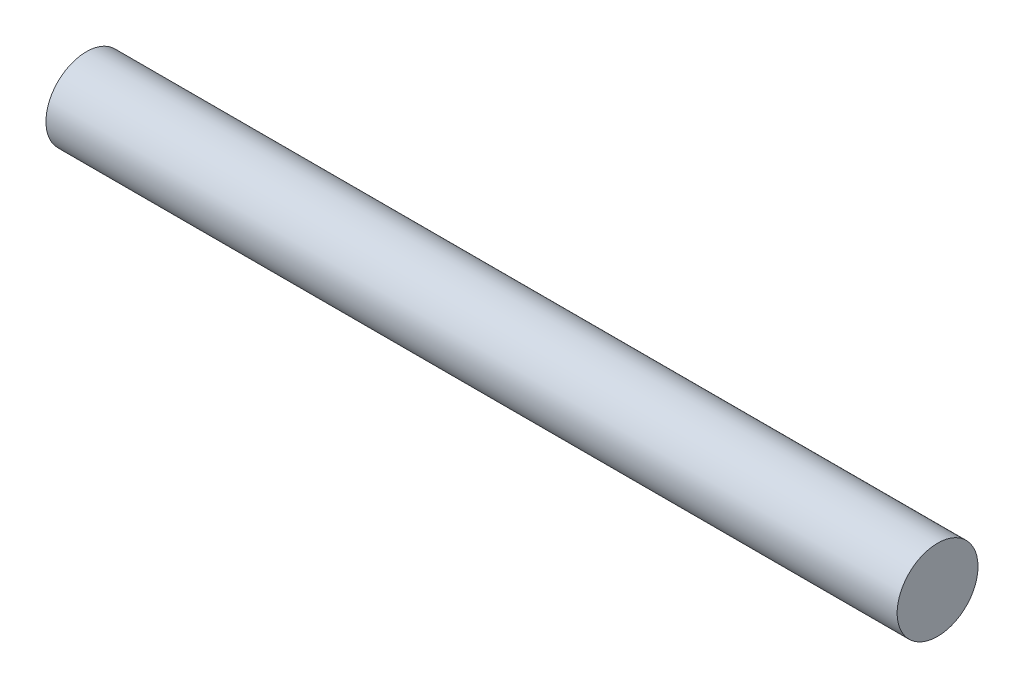
ISO-10303-21;
HEADER;
FILE_DESCRIPTION(('STEP AP214'),'2;1');
FILE_NAME('part.step','',(''),(''),'','','');
FILE_SCHEMA(('AUTOMOTIVE_DESIGN { 1 0 10303 214 1 1 1 1 }'));
ENDSEC;
DATA;
#1=APPLICATION_CONTEXT('core data for automotive mechanical design processes');
#2=APPLICATION_PROTOCOL_DEFINITION('international standard','automotive_design',2000,#1);
#3=PRODUCT_CONTEXT('',#1,'mechanical');
#4=PRODUCT('Part','Part','',(#3));
#5=PRODUCT_RELATED_PRODUCT_CATEGORY('part','',(#4));
#6=PRODUCT_DEFINITION_FORMATION('','',#4);
#7=PRODUCT_DEFINITION_CONTEXT('part definition',#1,'design');
#8=PRODUCT_DEFINITION('design','',#6,#7);
#9=PRODUCT_DEFINITION_SHAPE('','',#8);
#10=(LENGTH_UNIT() NAMED_UNIT(*) SI_UNIT(.MILLI.,.METRE.));
#11=(NAMED_UNIT(*) PLANE_ANGLE_UNIT() SI_UNIT($,.RADIAN.));
#12=(NAMED_UNIT(*) SI_UNIT($,.STERADIAN.) SOLID_ANGLE_UNIT());
#13=UNCERTAINTY_MEASURE_WITH_UNIT(LENGTH_MEASURE(1.E-05),#10,'distance_accuracy_value','');
#14=(GEOMETRIC_REPRESENTATION_CONTEXT(3) GLOBAL_UNCERTAINTY_ASSIGNED_CONTEXT((#13)) GLOBAL_UNIT_ASSIGNED_CONTEXT((#10,
#11,#12)) REPRESENTATION_CONTEXT('',''));
#15=CARTESIAN_POINT('',(0.,0.,0.));
#16=DIRECTION('',(0.,0.,1.));
#17=DIRECTION('',(1.,0.,0.));
#18=AXIS2_PLACEMENT_3D('',#15,#16,#17);
#19=CARTESIAN_POINT('',(267.5,0.,0.));
#20=DIRECTION('',(-1.,0.,0.));
#21=DIRECTION('',(0.,0.,1.));
#22=AXIS2_PLACEMENT_3D('',#19,#20,#21);
#23=CYLINDRICAL_SURFACE('',#22,25.4);
#24=CARTESIAN_POINT('',(267.5,0.,0.));
#25=DIRECTION('',(1.,0.,0.));
#26=DIRECTION('',(0.,0.,-1.));
#27=AXIS2_PLACEMENT_3D('',#24,#25,#26);
#28=CIRCLE('',#27,25.4);
#29=CARTESIAN_POINT('',(267.5,0.,-25.4));
#30=VERTEX_POINT('',#29);
#31=EDGE_CURVE('E10',#30,#30,#28,.T.);
#32=ORIENTED_EDGE('',*,*,#31,.F.);
#33=EDGE_LOOP('',(#32));
#34=FACE_BOUND('',#33,.T.);
#35=CARTESIAN_POINT('',(-267.5,0.,0.));
#36=DIRECTION('',(1.,0.,0.));
#37=DIRECTION('',(0.,0.,-1.));
#38=AXIS2_PLACEMENT_3D('',#35,#36,#37);
#39=CIRCLE('',#38,25.4);
#40=CARTESIAN_POINT('',(-267.5,0.,-25.4));
#41=VERTEX_POINT('',#40);
#42=EDGE_CURVE('E33',#41,#41,#39,.T.);
#43=ORIENTED_EDGE('',*,*,#42,.T.);
#44=EDGE_LOOP('',(#43));
#45=FACE_BOUND('',#44,.T.);
#46=ADVANCED_FACE('F30',(#34,#45),#23,.T.);
#47=CARTESIAN_POINT('',(267.5,0.,0.));
#48=DIRECTION('',(1.,0.,0.));
#49=DIRECTION('',(0.,0.,-1.));
#50=AXIS2_PLACEMENT_3D('',#47,#48,#49);
#51=PLANE('',#50);
#52=ORIENTED_EDGE('',*,*,#31,.T.);
#53=EDGE_LOOP('',(#52));
#54=FACE_BOUND('',#53,.T.);
#55=ADVANCED_FACE('F45',(#54),#51,.T.);
#56=CARTESIAN_POINT('',(-267.5,0.,0.));
#57=DIRECTION('',(1.,0.,0.));
#58=DIRECTION('',(0.,0.,-1.));
#59=AXIS2_PLACEMENT_3D('',#56,#57,#58);
#60=PLANE('',#59);
#61=ORIENTED_EDGE('',*,*,#42,.F.);
#62=EDGE_LOOP('',(#61));
#63=FACE_BOUND('',#62,.T.);
#64=ADVANCED_FACE('F43',(#63),#60,.F.);
#65=CLOSED_SHELL('',(#46,#55,#64));
#66=MANIFOLD_SOLID_BREP('B2',#65);
#67=ADVANCED_BREP_SHAPE_REPRESENTATION('',(#18,#66),#14);
#68=SHAPE_DEFINITION_REPRESENTATION(#9,#67);
ENDSEC;
END-ISO-10303-21;
